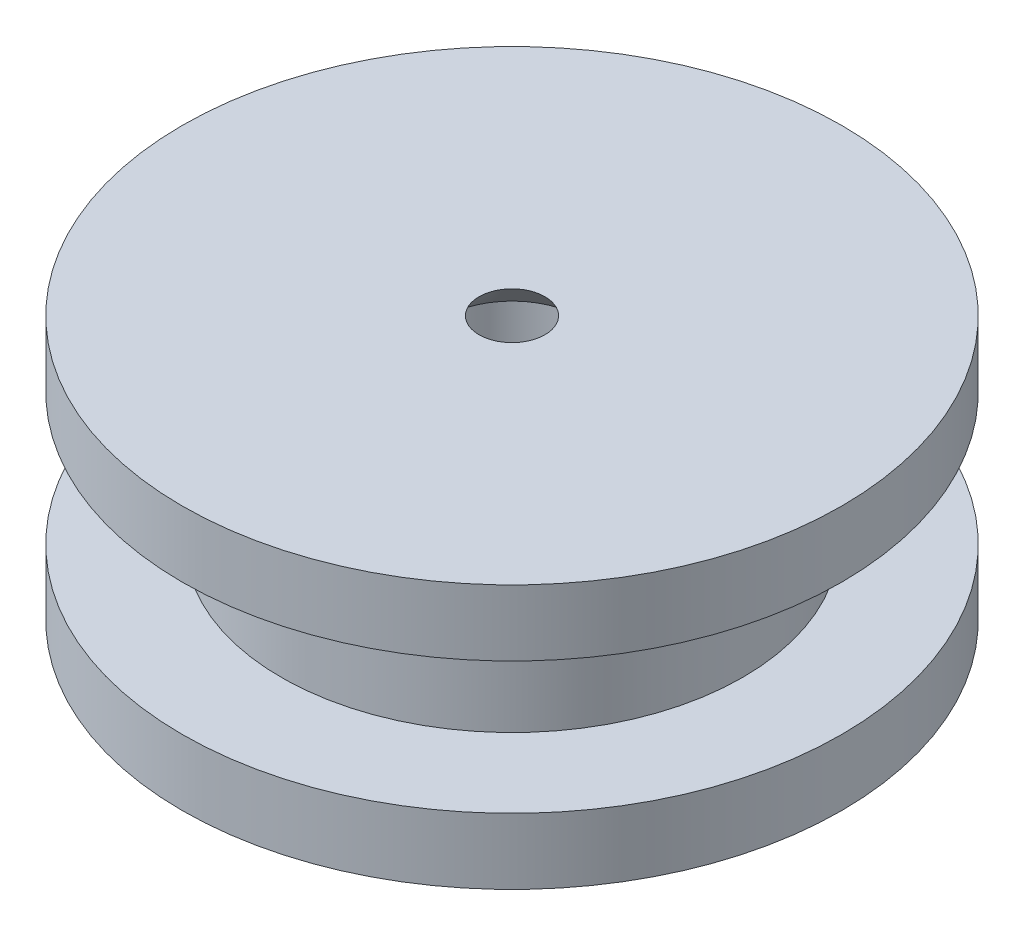
ISO-10303-21;
HEADER;
FILE_DESCRIPTION(('STEP AP214'),'2;1');
FILE_NAME('part.step','',(''),(''),'','','');
FILE_SCHEMA(('AUTOMOTIVE_DESIGN { 1 0 10303 214 1 1 1 1 }'));
ENDSEC;
DATA;
#1=APPLICATION_CONTEXT('core data for automotive mechanical design processes');
#2=APPLICATION_PROTOCOL_DEFINITION('international standard','automotive_design',2000,#1);
#3=PRODUCT_CONTEXT('',#1,'mechanical');
#4=PRODUCT('Part','Part','',(#3));
#5=PRODUCT_RELATED_PRODUCT_CATEGORY('part','',(#4));
#6=PRODUCT_DEFINITION_FORMATION('','',#4);
#7=PRODUCT_DEFINITION_CONTEXT('part definition',#1,'design');
#8=PRODUCT_DEFINITION('design','',#6,#7);
#9=PRODUCT_DEFINITION_SHAPE('','',#8);
#10=(LENGTH_UNIT() NAMED_UNIT(*) SI_UNIT(.MILLI.,.METRE.));
#11=(NAMED_UNIT(*) PLANE_ANGLE_UNIT() SI_UNIT($,.RADIAN.));
#12=(NAMED_UNIT(*) SI_UNIT($,.STERADIAN.) SOLID_ANGLE_UNIT());
#13=UNCERTAINTY_MEASURE_WITH_UNIT(LENGTH_MEASURE(1.E-05),#10,'distance_accuracy_value','');
#14=(GEOMETRIC_REPRESENTATION_CONTEXT(3) GLOBAL_UNCERTAINTY_ASSIGNED_CONTEXT((#13)) GLOBAL_UNIT_ASSIGNED_CONTEXT((#10,
#11,#12)) REPRESENTATION_CONTEXT('',''));
#15=CARTESIAN_POINT('',(0.,0.,0.));
#16=DIRECTION('',(0.,0.,1.));
#17=DIRECTION('',(1.,0.,0.));
#18=AXIS2_PLACEMENT_3D('',#15,#16,#17);
#19=CARTESIAN_POINT('',(0.,-2.,0.));
#20=DIRECTION('',(0.,-1.,0.));
#21=DIRECTION('',(1.,0.,0.));
#22=AXIS2_PLACEMENT_3D('',#19,#20,#21);
#23=CYLINDRICAL_SURFACE('',#22,1.05);
#24=CARTESIAN_POINT('',(0.,1.45,0.));
#25=DIRECTION('',(0.,-1.,0.));
#26=DIRECTION('',(1.,0.,0.));
#27=AXIS2_PLACEMENT_3D('',#24,#25,#26);
#28=CIRCLE('',#27,1.05);
#29=CARTESIAN_POINT('',(1.05,1.45,0.));
#30=VERTEX_POINT('',#29);
#31=EDGE_CURVE('E10',#30,#30,#28,.T.);
#32=ORIENTED_EDGE('',*,*,#31,.F.);
#33=EDGE_LOOP('',(#32));
#34=FACE_BOUND('',#33,.T.);
#35=CARTESIAN_POINT('',(0.,-2.,0.));
#36=DIRECTION('',(0.,-1.,0.));
#37=DIRECTION('',(1.,0.,0.));
#38=AXIS2_PLACEMENT_3D('',#35,#36,#37);
#39=CIRCLE('',#38,1.05);
#40=CARTESIAN_POINT('',(1.05,-2.,0.));
#41=VERTEX_POINT('',#40);
#42=EDGE_CURVE('E62',#41,#41,#39,.T.);
#43=ORIENTED_EDGE('',*,*,#42,.T.);
#44=EDGE_LOOP('',(#43));
#45=FACE_BOUND('',#44,.T.);
#46=ADVANCED_FACE('F31',(#34,#45),#23,.F.);
#47=CARTESIAN_POINT('',(0.,1.45,0.));
#48=DIRECTION('',(0.,-1.,0.));
#49=DIRECTION('',(1.,0.,0.));
#50=AXIS2_PLACEMENT_3D('',#47,#48,#49);
#51=CONICAL_SURFACE('',#50,1.05,0.785398163397451);
#52=CARTESIAN_POINT('',(0.,2.,0.));
#53=DIRECTION('',(0.,-1.,0.));
#54=DIRECTION('',(1.,0.,0.));
#55=AXIS2_PLACEMENT_3D('',#52,#53,#54);
#56=CIRCLE('',#55,0.499999999999998);
#57=CARTESIAN_POINT('',(0.499999999999997,2.,0.));
#58=VERTEX_POINT('',#57);
#59=EDGE_CURVE('E37',#58,#58,#56,.T.);
#60=ORIENTED_EDGE('',*,*,#59,.F.);
#61=EDGE_LOOP('',(#60));
#62=FACE_BOUND('',#61,.T.);
#63=ORIENTED_EDGE('',*,*,#31,.T.);
#64=EDGE_LOOP('',(#63));
#65=FACE_BOUND('',#64,.T.);
#66=ADVANCED_FACE('F105',(#62,#65),#51,.F.);
#67=CARTESIAN_POINT('',(0.,2.,0.));
#68=DIRECTION('',(0.,-1.,0.));
#69=DIRECTION('',(1.,0.,0.));
#70=AXIS2_PLACEMENT_3D('',#67,#68,#69);
#71=PLANE('',#70);
#72=CARTESIAN_POINT('',(0.,2.,0.));
#73=DIRECTION('',(0.,-1.,0.));
#74=DIRECTION('',(1.,0.,0.));
#75=AXIS2_PLACEMENT_3D('',#72,#73,#74);
#76=CIRCLE('',#75,5.);
#77=CARTESIAN_POINT('',(5.,2.,0.));
#78=VERTEX_POINT('',#77);
#79=EDGE_CURVE('E41',#78,#78,#76,.T.);
#80=ORIENTED_EDGE('',*,*,#79,.F.);
#81=EDGE_LOOP('',(#80));
#82=FACE_BOUND('',#81,.T.);
#83=ORIENTED_EDGE('',*,*,#59,.T.);
#84=EDGE_LOOP('',(#83));
#85=FACE_BOUND('',#84,.T.);
#86=ADVANCED_FACE('F100',(#82,#85),#71,.F.);
#87=CARTESIAN_POINT('',(0.,-2.,0.));
#88=DIRECTION('',(0.,-1.,0.));
#89=DIRECTION('',(1.,0.,0.));
#90=AXIS2_PLACEMENT_3D('',#87,#88,#89);
#91=CYLINDRICAL_SURFACE('',#90,5.);
#92=CARTESIAN_POINT('',(0.,1.,0.));
#93=DIRECTION('',(0.,-1.,0.));
#94=DIRECTION('',(1.,0.,0.));
#95=AXIS2_PLACEMENT_3D('',#92,#93,#94);
#96=CIRCLE('',#95,5.);
#97=CARTESIAN_POINT('',(5.,1.,0.));
#98=VERTEX_POINT('',#97);
#99=EDGE_CURVE('E45',#98,#98,#96,.T.);
#100=ORIENTED_EDGE('',*,*,#99,.F.);
#101=EDGE_LOOP('',(#100));
#102=FACE_BOUND('',#101,.T.);
#103=ORIENTED_EDGE('',*,*,#79,.T.);
#104=EDGE_LOOP('',(#103));
#105=FACE_BOUND('',#104,.T.);
#106=ADVANCED_FACE('F94',(#102,#105),#91,.T.);
#107=CARTESIAN_POINT('',(0.,1.,0.));
#108=DIRECTION('',(0.,1.,0.));
#109=DIRECTION('',(-1.,0.,0.));
#110=AXIS2_PLACEMENT_3D('',#107,#108,#109);
#111=PLANE('',#110);
#112=CARTESIAN_POINT('',(0.,1.,0.));
#113=DIRECTION('',(0.,-1.,0.));
#114=DIRECTION('',(1.,0.,0.));
#115=AXIS2_PLACEMENT_3D('',#112,#113,#114);
#116=CIRCLE('',#115,3.5);
#117=CARTESIAN_POINT('',(3.5,1.,0.));
#118=VERTEX_POINT('',#117);
#119=EDGE_CURVE('E50',#118,#118,#116,.T.);
#120=ORIENTED_EDGE('',*,*,#119,.F.);
#121=EDGE_LOOP('',(#120));
#122=FACE_BOUND('',#121,.T.);
#123=ORIENTED_EDGE('',*,*,#99,.T.);
#124=EDGE_LOOP('',(#123));
#125=FACE_BOUND('',#124,.T.);
#126=ADVANCED_FACE('F88',(#122,#125),#111,.F.);
#127=CARTESIAN_POINT('',(0.,-2.,0.));
#128=DIRECTION('',(0.,-1.,0.));
#129=DIRECTION('',(1.,0.,0.));
#130=AXIS2_PLACEMENT_3D('',#127,#128,#129);
#131=CYLINDRICAL_SURFACE('',#130,3.5);
#132=CARTESIAN_POINT('',(0.,-0.999999999999999,0.));
#133=DIRECTION('',(0.,-1.,0.));
#134=DIRECTION('',(1.,0.,0.));
#135=AXIS2_PLACEMENT_3D('',#132,#133,#134);
#136=CIRCLE('',#135,3.5);
#137=CARTESIAN_POINT('',(3.5,-0.999999999999998,0.));
#138=VERTEX_POINT('',#137);
#139=EDGE_CURVE('E53',#138,#138,#136,.T.);
#140=ORIENTED_EDGE('',*,*,#139,.F.);
#141=EDGE_LOOP('',(#140));
#142=FACE_BOUND('',#141,.T.);
#143=ORIENTED_EDGE('',*,*,#119,.T.);
#144=EDGE_LOOP('',(#143));
#145=FACE_BOUND('',#144,.T.);
#146=ADVANCED_FACE('F82',(#142,#145),#131,.T.);
#147=CARTESIAN_POINT('',(0.,-0.999999999999999,0.));
#148=DIRECTION('',(0.,-1.,0.));
#149=DIRECTION('',(1.,0.,0.));
#150=AXIS2_PLACEMENT_3D('',#147,#148,#149);
#151=PLANE('',#150);
#152=CARTESIAN_POINT('',(0.,-0.999999999999999,0.));
#153=DIRECTION('',(0.,-1.,0.));
#154=DIRECTION('',(1.,0.,0.));
#155=AXIS2_PLACEMENT_3D('',#152,#153,#154);
#156=CIRCLE('',#155,5.);
#157=CARTESIAN_POINT('',(5.,-0.999999999999998,0.));
#158=VERTEX_POINT('',#157);
#159=EDGE_CURVE('E56',#158,#158,#156,.T.);
#160=ORIENTED_EDGE('',*,*,#159,.F.);
#161=EDGE_LOOP('',(#160));
#162=FACE_BOUND('',#161,.T.);
#163=ORIENTED_EDGE('',*,*,#139,.T.);
#164=EDGE_LOOP('',(#163));
#165=FACE_BOUND('',#164,.T.);
#166=ADVANCED_FACE('F76',(#162,#165),#151,.F.);
#167=CARTESIAN_POINT('',(0.,-2.,0.));
#168=DIRECTION('',(0.,-1.,0.));
#169=DIRECTION('',(1.,0.,0.));
#170=AXIS2_PLACEMENT_3D('',#167,#168,#169);
#171=CYLINDRICAL_SURFACE('',#170,5.);
#172=CARTESIAN_POINT('',(0.,-2.,0.));
#173=DIRECTION('',(0.,-1.,0.));
#174=DIRECTION('',(1.,0.,0.));
#175=AXIS2_PLACEMENT_3D('',#172,#173,#174);
#176=CIRCLE('',#175,5.);
#177=CARTESIAN_POINT('',(5.,-2.,0.));
#178=VERTEX_POINT('',#177);
#179=EDGE_CURVE('E59',#178,#178,#176,.T.);
#180=ORIENTED_EDGE('',*,*,#179,.F.);
#181=EDGE_LOOP('',(#180));
#182=FACE_BOUND('',#181,.T.);
#183=ORIENTED_EDGE('',*,*,#159,.T.);
#184=EDGE_LOOP('',(#183));
#185=FACE_BOUND('',#184,.T.);
#186=ADVANCED_FACE('F70',(#182,#185),#171,.T.);
#187=CARTESIAN_POINT('',(0.,-2.,0.));
#188=DIRECTION('',(0.,1.,0.));
#189=DIRECTION('',(-1.,0.,0.));
#190=AXIS2_PLACEMENT_3D('',#187,#188,#189);
#191=PLANE('',#190);
#192=ORIENTED_EDGE('',*,*,#42,.F.);
#193=EDGE_LOOP('',(#192));
#194=FACE_BOUND('',#193,.T.);
#195=ORIENTED_EDGE('',*,*,#179,.T.);
#196=EDGE_LOOP('',(#195));
#197=FACE_BOUND('',#196,.T.);
#198=ADVANCED_FACE('F67',(#194,#197),#191,.F.);
#199=CLOSED_SHELL('',(#46,#66,#86,#106,#126,#146,#166,#186,#198));
#200=MANIFOLD_SOLID_BREP('B2',#199);
#201=ADVANCED_BREP_SHAPE_REPRESENTATION('',(#18,#200),#14);
#202=SHAPE_DEFINITION_REPRESENTATION(#9,#201);
ENDSEC;
END-ISO-10303-21;
